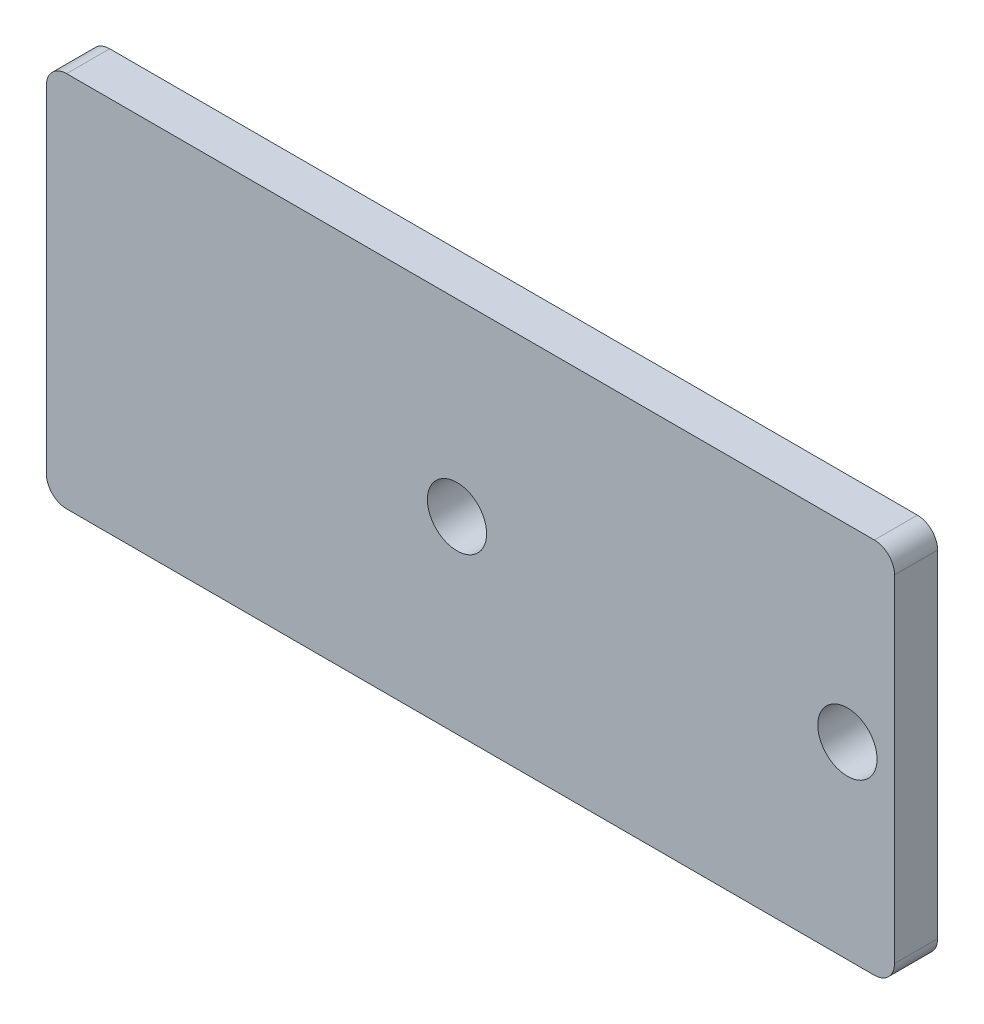
ISO-10303-21;
HEADER;
FILE_DESCRIPTION(('STEP AP214'),'2;1');
FILE_NAME('part.step','',(''),(''),'','','');
FILE_SCHEMA(('AUTOMOTIVE_DESIGN { 1 0 10303 214 1 1 1 1 }'));
ENDSEC;
DATA;
#1=APPLICATION_CONTEXT('core data for automotive mechanical design processes');
#2=APPLICATION_PROTOCOL_DEFINITION('international standard','automotive_design',2000,#1);
#3=PRODUCT_CONTEXT('',#1,'mechanical');
#4=PRODUCT('Part','Part','',(#3));
#5=PRODUCT_RELATED_PRODUCT_CATEGORY('part','',(#4));
#6=PRODUCT_DEFINITION_FORMATION('','',#4);
#7=PRODUCT_DEFINITION_CONTEXT('part definition',#1,'design');
#8=PRODUCT_DEFINITION('design','',#6,#7);
#9=PRODUCT_DEFINITION_SHAPE('','',#8);
#10=(LENGTH_UNIT() NAMED_UNIT(*) SI_UNIT(.MILLI.,.METRE.));
#11=(NAMED_UNIT(*) PLANE_ANGLE_UNIT() SI_UNIT($,.RADIAN.));
#12=(NAMED_UNIT(*) SI_UNIT($,.STERADIAN.) SOLID_ANGLE_UNIT());
#13=UNCERTAINTY_MEASURE_WITH_UNIT(LENGTH_MEASURE(1.E-05),#10,'distance_accuracy_value','');
#14=(GEOMETRIC_REPRESENTATION_CONTEXT(3) GLOBAL_UNCERTAINTY_ASSIGNED_CONTEXT((#13)) GLOBAL_UNIT_ASSIGNED_CONTEXT((#10,
#11,#12)) REPRESENTATION_CONTEXT('',''));
#15=CARTESIAN_POINT('',(0.,0.,0.));
#16=DIRECTION('',(0.,0.,1.));
#17=DIRECTION('',(1.,0.,0.));
#18=AXIS2_PLACEMENT_3D('',#15,#16,#17);
#19=CARTESIAN_POINT('',(15.,6.25,0.8));
#20=DIRECTION('',(0.,0.,1.));
#21=DIRECTION('',(1.,0.,0.));
#22=AXIS2_PLACEMENT_3D('',#19,#20,#21);
#23=PLANE('',#22);
#24=CARTESIAN_POINT('',(-0.499999999999995,0.,0.8));
#25=DIRECTION('',(0.,0.,1.));
#26=DIRECTION('',(1.,0.,0.));
#27=AXIS2_PLACEMENT_3D('',#24,#25,#26);
#28=CIRCLE('',#27,1.1);
#29=CARTESIAN_POINT('',(0.600000000000004,0.,0.8));
#30=VERTEX_POINT('',#29);
#31=EDGE_CURVE('E133',#30,#30,#28,.T.);
#32=ORIENTED_EDGE('',*,*,#31,.F.);
#33=EDGE_LOOP('',(#32));
#34=FACE_BOUND('',#33,.T.);
#35=CARTESIAN_POINT('',(15.,6.25,0.8));
#36=DIRECTION('',(0.,0.,1.));
#37=DIRECTION('',(1.,0.,0.));
#38=AXIS2_PLACEMENT_3D('',#35,#36,#37);
#39=CIRCLE('',#38,0.750000000000003);
#40=CARTESIAN_POINT('',(15.75,6.25,0.8));
#41=VERTEX_POINT('',#40);
#42=CARTESIAN_POINT('',(15.,7.,0.8));
#43=VERTEX_POINT('',#42);
#44=EDGE_CURVE('E144',#41,#43,#39,.T.);
#45=ORIENTED_EDGE('',*,*,#44,.T.);
#46=DIRECTION('',(-1.,0.,0.));
#47=VECTOR('',#46,1.);
#48=CARTESIAN_POINT('',(15.,7.,0.8));
#49=LINE('',#48,#47);
#50=CARTESIAN_POINT('',(-15.,7.,0.8));
#51=VERTEX_POINT('',#50);
#52=EDGE_CURVE('E92',#43,#51,#49,.T.);
#53=ORIENTED_EDGE('',*,*,#52,.T.);
#54=CARTESIAN_POINT('',(-15.,6.25,0.8));
#55=DIRECTION('',(0.,0.,1.));
#56=DIRECTION('',(1.,0.,0.));
#57=AXIS2_PLACEMENT_3D('',#54,#55,#56);
#58=CIRCLE('',#57,0.750000000000003);
#59=CARTESIAN_POINT('',(-15.75,6.25,0.8));
#60=VERTEX_POINT('',#59);
#61=EDGE_CURVE('E159',#51,#60,#58,.T.);
#62=ORIENTED_EDGE('',*,*,#61,.T.);
#63=DIRECTION('',(0.,-1.,0.));
#64=VECTOR('',#63,1.);
#65=CARTESIAN_POINT('',(-15.75,6.25,0.8));
#66=LINE('',#65,#64);
#67=CARTESIAN_POINT('',(-15.75,-6.25,0.8));
#68=VERTEX_POINT('',#67);
#69=EDGE_CURVE('E172',#60,#68,#66,.T.);
#70=ORIENTED_EDGE('',*,*,#69,.T.);
#71=CARTESIAN_POINT('',(-15.,-6.25,0.8));
#72=DIRECTION('',(0.,0.,1.));
#73=DIRECTION('',(1.,0.,0.));
#74=AXIS2_PLACEMENT_3D('',#71,#72,#73);
#75=CIRCLE('',#74,0.75);
#76=CARTESIAN_POINT('',(-15.,-7.,0.8));
#77=VERTEX_POINT('',#76);
#78=EDGE_CURVE('E111',#68,#77,#75,.T.);
#79=ORIENTED_EDGE('',*,*,#78,.T.);
#80=DIRECTION('',(1.,0.,0.));
#81=VECTOR('',#80,1.);
#82=CARTESIAN_POINT('',(-15.,-7.,0.8));
#83=LINE('',#82,#81);
#84=CARTESIAN_POINT('',(15.,-7.,0.8));
#85=VERTEX_POINT('',#84);
#86=EDGE_CURVE('E105',#77,#85,#83,.T.);
#87=ORIENTED_EDGE('',*,*,#86,.T.);
#88=CARTESIAN_POINT('',(15.,-6.25,0.8));
#89=DIRECTION('',(0.,0.,1.));
#90=DIRECTION('',(1.,0.,0.));
#91=AXIS2_PLACEMENT_3D('',#88,#89,#90);
#92=CIRCLE('',#91,0.750000000000004);
#93=CARTESIAN_POINT('',(15.75,-6.25,0.8));
#94=VERTEX_POINT('',#93);
#95=EDGE_CURVE('E109',#85,#94,#92,.T.);
#96=ORIENTED_EDGE('',*,*,#95,.T.);
#97=DIRECTION('',(0.,1.,0.));
#98=VECTOR('',#97,1.);
#99=CARTESIAN_POINT('',(15.75,-6.25,0.8));
#100=LINE('',#99,#98);
#101=EDGE_CURVE('E49',#94,#41,#100,.T.);
#102=ORIENTED_EDGE('',*,*,#101,.T.);
#103=EDGE_LOOP('',(#45,#53,#62,#70,#79,#87,#96,#102));
#104=FACE_BOUND('',#103,.T.);
#105=CARTESIAN_POINT('',(14.,0.,0.8));
#106=DIRECTION('',(0.,0.,1.));
#107=DIRECTION('',(1.,0.,0.));
#108=AXIS2_PLACEMENT_3D('',#105,#106,#107);
#109=CIRCLE('',#108,1.1);
#110=CARTESIAN_POINT('',(15.1,0.,0.8));
#111=VERTEX_POINT('',#110);
#112=EDGE_CURVE('E181',#111,#111,#109,.T.);
#113=ORIENTED_EDGE('',*,*,#112,.F.);
#114=EDGE_LOOP('',(#113));
#115=FACE_BOUND('',#114,.T.);
#116=ADVANCED_FACE('F32',(#34,#104,#115),#23,.T.);
#117=CARTESIAN_POINT('',(15.,6.25,-0.8));
#118=DIRECTION('',(0.,0.,1.));
#119=DIRECTION('',(1.,0.,0.));
#120=AXIS2_PLACEMENT_3D('',#117,#118,#119);
#121=PLANE('',#120);
#122=CARTESIAN_POINT('',(15.,6.25,-0.8));
#123=DIRECTION('',(0.,0.,1.));
#124=DIRECTION('',(1.,0.,0.));
#125=AXIS2_PLACEMENT_3D('',#122,#123,#124);
#126=CIRCLE('',#125,0.750000000000003);
#127=CARTESIAN_POINT('',(15.75,6.25,-0.8));
#128=VERTEX_POINT('',#127);
#129=CARTESIAN_POINT('',(15.,7.,-0.8));
#130=VERTEX_POINT('',#129);
#131=EDGE_CURVE('E129',#128,#130,#126,.T.);
#132=ORIENTED_EDGE('',*,*,#131,.F.);
#133=DIRECTION('',(0.,1.,0.));
#134=VECTOR('',#133,1.);
#135=CARTESIAN_POINT('',(15.75,-6.25,-0.8));
#136=LINE('',#135,#134);
#137=CARTESIAN_POINT('',(15.75,-6.25,-0.8));
#138=VERTEX_POINT('',#137);
#139=EDGE_CURVE('E84',#138,#128,#136,.T.);
#140=ORIENTED_EDGE('',*,*,#139,.F.);
#141=CARTESIAN_POINT('',(15.,-6.25,-0.8));
#142=DIRECTION('',(0.,0.,1.));
#143=DIRECTION('',(1.,0.,0.));
#144=AXIS2_PLACEMENT_3D('',#141,#142,#143);
#145=CIRCLE('',#144,0.750000000000004);
#146=CARTESIAN_POINT('',(15.,-7.,-0.8));
#147=VERTEX_POINT('',#146);
#148=EDGE_CURVE('E78',#147,#138,#145,.T.);
#149=ORIENTED_EDGE('',*,*,#148,.F.);
#150=DIRECTION('',(1.,0.,0.));
#151=VECTOR('',#150,1.);
#152=CARTESIAN_POINT('',(-15.,-7.,-0.8));
#153=LINE('',#152,#151);
#154=CARTESIAN_POINT('',(-15.,-7.,-0.8));
#155=VERTEX_POINT('',#154);
#156=EDGE_CURVE('E119',#155,#147,#153,.T.);
#157=ORIENTED_EDGE('',*,*,#156,.F.);
#158=CARTESIAN_POINT('',(-15.,-6.25,-0.8));
#159=DIRECTION('',(0.,0.,1.));
#160=DIRECTION('',(1.,0.,0.));
#161=AXIS2_PLACEMENT_3D('',#158,#159,#160);
#162=CIRCLE('',#161,0.75);
#163=CARTESIAN_POINT('',(-15.75,-6.25,-0.8));
#164=VERTEX_POINT('',#163);
#165=EDGE_CURVE('E139',#164,#155,#162,.T.);
#166=ORIENTED_EDGE('',*,*,#165,.F.);
#167=DIRECTION('',(0.,-1.,0.));
#168=VECTOR('',#167,1.);
#169=CARTESIAN_POINT('',(-15.75,6.25,-0.8));
#170=LINE('',#169,#168);
#171=CARTESIAN_POINT('',(-15.75,6.25,-0.8));
#172=VERTEX_POINT('',#171);
#173=EDGE_CURVE('E137',#172,#164,#170,.T.);
#174=ORIENTED_EDGE('',*,*,#173,.F.);
#175=CARTESIAN_POINT('',(-15.,6.25,-0.8));
#176=DIRECTION('',(0.,0.,1.));
#177=DIRECTION('',(1.,0.,0.));
#178=AXIS2_PLACEMENT_3D('',#175,#176,#177);
#179=CIRCLE('',#178,0.750000000000003);
#180=CARTESIAN_POINT('',(-15.,7.,-0.8));
#181=VERTEX_POINT('',#180);
#182=EDGE_CURVE('E135',#181,#172,#179,.T.);
#183=ORIENTED_EDGE('',*,*,#182,.F.);
#184=DIRECTION('',(-1.,0.,0.));
#185=VECTOR('',#184,1.);
#186=CARTESIAN_POINT('',(15.,7.,-0.8));
#187=LINE('',#186,#185);
#188=EDGE_CURVE('E132',#130,#181,#187,.T.);
#189=ORIENTED_EDGE('',*,*,#188,.F.);
#190=EDGE_LOOP('',(#132,#140,#149,#157,#166,#174,#183,#189));
#191=FACE_BOUND('',#190,.T.);
#192=CARTESIAN_POINT('',(-0.499999999999995,0.,-0.8));
#193=DIRECTION('',(0.,0.,1.));
#194=DIRECTION('',(1.,0.,0.));
#195=AXIS2_PLACEMENT_3D('',#192,#193,#194);
#196=CIRCLE('',#195,1.1);
#197=CARTESIAN_POINT('',(0.600000000000004,0.,-0.8));
#198=VERTEX_POINT('',#197);
#199=EDGE_CURVE('E178',#198,#198,#196,.T.);
#200=ORIENTED_EDGE('',*,*,#199,.T.);
#201=EDGE_LOOP('',(#200));
#202=FACE_BOUND('',#201,.T.);
#203=CARTESIAN_POINT('',(14.,0.,-0.8));
#204=DIRECTION('',(0.,0.,1.));
#205=DIRECTION('',(1.,0.,0.));
#206=AXIS2_PLACEMENT_3D('',#203,#204,#205);
#207=CIRCLE('',#206,1.1);
#208=CARTESIAN_POINT('',(15.1,0.,-0.8));
#209=VERTEX_POINT('',#208);
#210=EDGE_CURVE('E184',#209,#209,#207,.T.);
#211=ORIENTED_EDGE('',*,*,#210,.T.);
#212=EDGE_LOOP('',(#211));
#213=FACE_BOUND('',#212,.T.);
#214=ADVANCED_FACE('F163',(#191,#202,#213),#121,.F.);
#215=CARTESIAN_POINT('',(15.,6.25,0.8));
#216=DIRECTION('',(0.,0.,-1.));
#217=DIRECTION('',(-1.,0.,0.));
#218=AXIS2_PLACEMENT_3D('',#215,#216,#217);
#219=CYLINDRICAL_SURFACE('',#218,0.750000000000003);
#220=ORIENTED_EDGE('',*,*,#131,.T.);
#221=DIRECTION('',(0.,0.,-1.));
#222=VECTOR('',#221,1.);
#223=CARTESIAN_POINT('',(15.,7.,0.8));
#224=LINE('',#223,#222);
#225=EDGE_CURVE('E11',#43,#130,#224,.T.);
#226=ORIENTED_EDGE('',*,*,#225,.F.);
#227=ORIENTED_EDGE('',*,*,#44,.F.);
#228=DIRECTION('',(0.,0.,-1.));
#229=VECTOR('',#228,1.);
#230=CARTESIAN_POINT('',(15.75,6.25,0.8));
#231=LINE('',#230,#229);
#232=EDGE_CURVE('E125',#41,#128,#231,.T.);
#233=ORIENTED_EDGE('',*,*,#232,.T.);
#234=EDGE_LOOP('',(#220,#226,#227,#233));
#235=FACE_BOUND('',#234,.T.);
#236=ADVANCED_FACE('F34',(#235),#219,.T.);
#237=CARTESIAN_POINT('',(15.,7.,0.8));
#238=DIRECTION('',(0.,-1.,0.));
#239=DIRECTION('',(1.,0.,0.));
#240=AXIS2_PLACEMENT_3D('',#237,#238,#239);
#241=PLANE('',#240);
#242=ORIENTED_EDGE('',*,*,#188,.T.);
#243=DIRECTION('',(0.,0.,-1.));
#244=VECTOR('',#243,1.);
#245=CARTESIAN_POINT('',(-15.,7.,0.8));
#246=LINE('',#245,#244);
#247=EDGE_CURVE('E41',#51,#181,#246,.T.);
#248=ORIENTED_EDGE('',*,*,#247,.F.);
#249=ORIENTED_EDGE('',*,*,#52,.F.);
#250=ORIENTED_EDGE('',*,*,#225,.T.);
#251=EDGE_LOOP('',(#242,#248,#249,#250));
#252=FACE_BOUND('',#251,.T.);
#253=ADVANCED_FACE('F216',(#252),#241,.F.);
#254=CARTESIAN_POINT('',(-15.,6.25,0.8));
#255=DIRECTION('',(0.,0.,-1.));
#256=DIRECTION('',(-1.,0.,0.));
#257=AXIS2_PLACEMENT_3D('',#254,#255,#256);
#258=CYLINDRICAL_SURFACE('',#257,0.750000000000003);
#259=ORIENTED_EDGE('',*,*,#182,.T.);
#260=DIRECTION('',(0.,0.,-1.));
#261=VECTOR('',#260,1.);
#262=CARTESIAN_POINT('',(-15.75,6.25,0.8));
#263=LINE('',#262,#261);
#264=EDGE_CURVE('E151',#60,#172,#263,.T.);
#265=ORIENTED_EDGE('',*,*,#264,.F.);
#266=ORIENTED_EDGE('',*,*,#61,.F.);
#267=ORIENTED_EDGE('',*,*,#247,.T.);
#268=EDGE_LOOP('',(#259,#265,#266,#267));
#269=FACE_BOUND('',#268,.T.);
#270=ADVANCED_FACE('F157',(#269),#258,.T.);
#271=CARTESIAN_POINT('',(-15.75,6.25,0.8));
#272=DIRECTION('',(1.,0.,0.));
#273=DIRECTION('',(0.,1.,0.));
#274=AXIS2_PLACEMENT_3D('',#271,#272,#273);
#275=PLANE('',#274);
#276=ORIENTED_EDGE('',*,*,#173,.T.);
#277=DIRECTION('',(0.,0.,-1.));
#278=VECTOR('',#277,1.);
#279=CARTESIAN_POINT('',(-15.75,-6.25,0.8));
#280=LINE('',#279,#278);
#281=EDGE_CURVE('E148',#68,#164,#280,.T.);
#282=ORIENTED_EDGE('',*,*,#281,.F.);
#283=ORIENTED_EDGE('',*,*,#69,.F.);
#284=ORIENTED_EDGE('',*,*,#264,.T.);
#285=EDGE_LOOP('',(#276,#282,#283,#284));
#286=FACE_BOUND('',#285,.T.);
#287=ADVANCED_FACE('F168',(#286),#275,.F.);
#288=CARTESIAN_POINT('',(-15.,-6.25,0.8));
#289=DIRECTION('',(0.,0.,-1.));
#290=DIRECTION('',(-1.,0.,0.));
#291=AXIS2_PLACEMENT_3D('',#288,#289,#290);
#292=CYLINDRICAL_SURFACE('',#291,0.75);
#293=ORIENTED_EDGE('',*,*,#165,.T.);
#294=DIRECTION('',(0.,0.,-1.));
#295=VECTOR('',#294,1.);
#296=CARTESIAN_POINT('',(-15.,-7.,0.8));
#297=LINE('',#296,#295);
#298=EDGE_CURVE('E120',#77,#155,#297,.T.);
#299=ORIENTED_EDGE('',*,*,#298,.F.);
#300=ORIENTED_EDGE('',*,*,#78,.F.);
#301=ORIENTED_EDGE('',*,*,#281,.T.);
#302=EDGE_LOOP('',(#293,#299,#300,#301));
#303=FACE_BOUND('',#302,.T.);
#304=ADVANCED_FACE('F171',(#303),#292,.T.);
#305=CARTESIAN_POINT('',(-15.,-7.,0.8));
#306=DIRECTION('',(0.,1.,0.));
#307=DIRECTION('',(-1.,0.,0.));
#308=AXIS2_PLACEMENT_3D('',#305,#306,#307);
#309=PLANE('',#308);
#310=ORIENTED_EDGE('',*,*,#156,.T.);
#311=DIRECTION('',(0.,0.,-1.));
#312=VECTOR('',#311,1.);
#313=CARTESIAN_POINT('',(15.,-7.,0.8));
#314=LINE('',#313,#312);
#315=EDGE_CURVE('E116',#85,#147,#314,.T.);
#316=ORIENTED_EDGE('',*,*,#315,.F.);
#317=ORIENTED_EDGE('',*,*,#86,.F.);
#318=ORIENTED_EDGE('',*,*,#298,.T.);
#319=EDGE_LOOP('',(#310,#316,#317,#318));
#320=FACE_BOUND('',#319,.T.);
#321=ADVANCED_FACE('F117',(#320),#309,.F.);
#322=CARTESIAN_POINT('',(15.,-6.25,0.8));
#323=DIRECTION('',(0.,0.,-1.));
#324=DIRECTION('',(-1.,0.,0.));
#325=AXIS2_PLACEMENT_3D('',#322,#323,#324);
#326=CYLINDRICAL_SURFACE('',#325,0.750000000000004);
#327=ORIENTED_EDGE('',*,*,#148,.T.);
#328=DIRECTION('',(0.,0.,-1.));
#329=VECTOR('',#328,1.);
#330=CARTESIAN_POINT('',(15.75,-6.25,0.8));
#331=LINE('',#330,#329);
#332=EDGE_CURVE('E121',#94,#138,#331,.T.);
#333=ORIENTED_EDGE('',*,*,#332,.F.);
#334=ORIENTED_EDGE('',*,*,#95,.F.);
#335=ORIENTED_EDGE('',*,*,#315,.T.);
#336=EDGE_LOOP('',(#327,#333,#334,#335));
#337=FACE_BOUND('',#336,.T.);
#338=ADVANCED_FACE('F123',(#337),#326,.T.);
#339=CARTESIAN_POINT('',(15.75,-6.25,0.8));
#340=DIRECTION('',(-1.,0.,0.));
#341=DIRECTION('',(0.,-1.,0.));
#342=AXIS2_PLACEMENT_3D('',#339,#340,#341);
#343=PLANE('',#342);
#344=ORIENTED_EDGE('',*,*,#139,.T.);
#345=ORIENTED_EDGE('',*,*,#232,.F.);
#346=ORIENTED_EDGE('',*,*,#101,.F.);
#347=ORIENTED_EDGE('',*,*,#332,.T.);
#348=EDGE_LOOP('',(#344,#345,#346,#347));
#349=FACE_BOUND('',#348,.T.);
#350=ADVANCED_FACE('F204',(#349),#343,.F.);
#351=CARTESIAN_POINT('',(-0.499999999999995,0.,0.8));
#352=DIRECTION('',(0.,0.,-1.));
#353=DIRECTION('',(-1.,0.,0.));
#354=AXIS2_PLACEMENT_3D('',#351,#352,#353);
#355=CYLINDRICAL_SURFACE('',#354,1.1);
#356=ORIENTED_EDGE('',*,*,#31,.T.);
#357=EDGE_LOOP('',(#356));
#358=FACE_BOUND('',#357,.T.);
#359=ORIENTED_EDGE('',*,*,#199,.F.);
#360=EDGE_LOOP('',(#359));
#361=FACE_BOUND('',#360,.T.);
#362=ADVANCED_FACE('F201',(#358,#361),#355,.F.);
#363=CARTESIAN_POINT('',(14.,0.,0.8));
#364=DIRECTION('',(0.,0.,-1.));
#365=DIRECTION('',(-1.,0.,0.));
#366=AXIS2_PLACEMENT_3D('',#363,#364,#365);
#367=CYLINDRICAL_SURFACE('',#366,1.1);
#368=ORIENTED_EDGE('',*,*,#112,.T.);
#369=EDGE_LOOP('',(#368));
#370=FACE_BOUND('',#369,.T.);
#371=ORIENTED_EDGE('',*,*,#210,.F.);
#372=EDGE_LOOP('',(#371));
#373=FACE_BOUND('',#372,.T.);
#374=ADVANCED_FACE('F190',(#370,#373),#367,.F.);
#375=CLOSED_SHELL('',(#116,#214,#236,#253,#270,#287,#304,#321,#338,#350,#362,#374));
#376=MANIFOLD_SOLID_BREP('B2',#375);
#377=ADVANCED_BREP_SHAPE_REPRESENTATION('',(#18,#376),#14);
#378=SHAPE_DEFINITION_REPRESENTATION(#9,#377);
ENDSEC;
END-ISO-10303-21;
